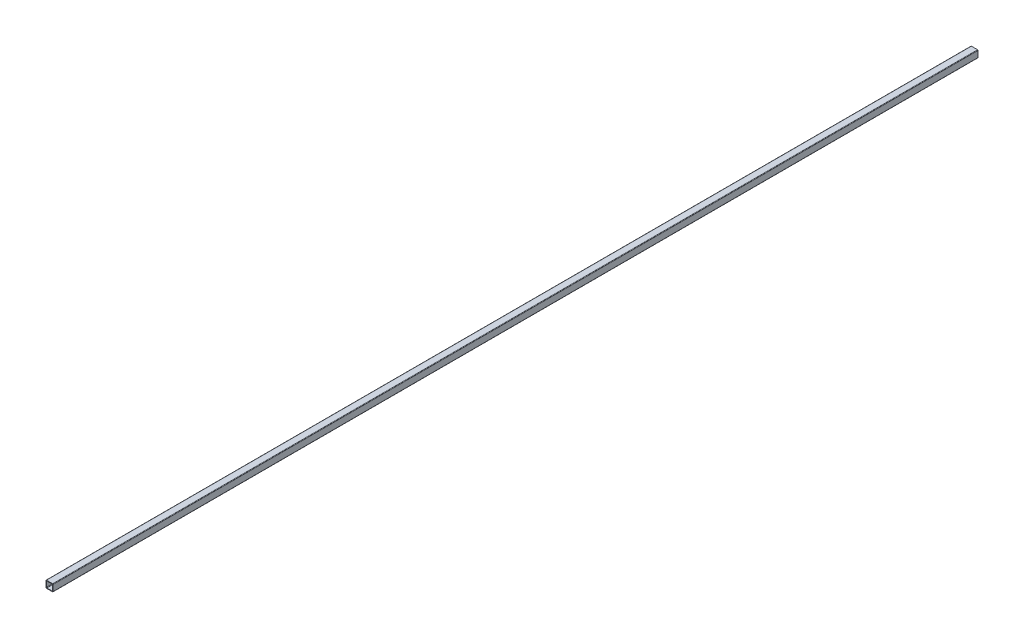
ISO-10303-21;
HEADER;
FILE_DESCRIPTION(('STEP AP214'),'2;1');
FILE_NAME('part.step','',(''),(''),'','','');
FILE_SCHEMA(('AUTOMOTIVE_DESIGN { 1 0 10303 214 1 1 1 1 }'));
ENDSEC;
DATA;
#1=APPLICATION_CONTEXT('core data for automotive mechanical design processes');
#2=APPLICATION_PROTOCOL_DEFINITION('international standard','automotive_design',2000,#1);
#3=PRODUCT_CONTEXT('',#1,'mechanical');
#4=PRODUCT('Part','Part','',(#3));
#5=PRODUCT_RELATED_PRODUCT_CATEGORY('part','',(#4));
#6=PRODUCT_DEFINITION_FORMATION('','',#4);
#7=PRODUCT_DEFINITION_CONTEXT('part definition',#1,'design');
#8=PRODUCT_DEFINITION('design','',#6,#7);
#9=PRODUCT_DEFINITION_SHAPE('','',#8);
#10=(LENGTH_UNIT() NAMED_UNIT(*) SI_UNIT(.MILLI.,.METRE.));
#11=(NAMED_UNIT(*) PLANE_ANGLE_UNIT() SI_UNIT($,.RADIAN.));
#12=(NAMED_UNIT(*) SI_UNIT($,.STERADIAN.) SOLID_ANGLE_UNIT());
#13=UNCERTAINTY_MEASURE_WITH_UNIT(LENGTH_MEASURE(1.E-05),#10,'distance_accuracy_value','');
#14=(GEOMETRIC_REPRESENTATION_CONTEXT(3) GLOBAL_UNCERTAINTY_ASSIGNED_CONTEXT((#13)) GLOBAL_UNIT_ASSIGNED_CONTEXT((#10,
#11,#12)) REPRESENTATION_CONTEXT('',''));
#15=CARTESIAN_POINT('',(0.,0.,0.));
#16=DIRECTION('',(0.,0.,1.));
#17=DIRECTION('',(1.,0.,0.));
#18=AXIS2_PLACEMENT_3D('',#15,#16,#17);
#19=CARTESIAN_POINT('',(2.54,-35.56,5000.));
#20=DIRECTION('',(0.,0.,1.));
#21=DIRECTION('',(1.,0.,0.));
#22=AXIS2_PLACEMENT_3D('',#19,#20,#21);
#23=PLANE('',#22);
#24=CARTESIAN_POINT('',(2.54,-35.56,5000.));
#25=DIRECTION('',(0.,0.,1.));
#26=DIRECTION('',(1.,0.,0.));
#27=AXIS2_PLACEMENT_3D('',#24,#25,#26);
#28=CIRCLE('',#27,2.54);
#29=CARTESIAN_POINT('',(0.,-35.56,5000.));
#30=VERTEX_POINT('',#29);
#31=CARTESIAN_POINT('',(2.54000000000002,-38.1,5000.));
#32=VERTEX_POINT('',#31);
#33=EDGE_CURVE('E214',#30,#32,#28,.T.);
#34=ORIENTED_EDGE('',*,*,#33,.T.);
#35=DIRECTION('',(1.,0.,0.));
#36=VECTOR('',#35,1.);
#37=CARTESIAN_POINT('',(2.54000000000002,-38.1,5000.));
#38=LINE('',#37,#36);
#39=CARTESIAN_POINT('',(35.56,-38.1,5000.));
#40=VERTEX_POINT('',#39);
#41=EDGE_CURVE('E217',#32,#40,#38,.T.);
#42=ORIENTED_EDGE('',*,*,#41,.T.);
#43=CARTESIAN_POINT('',(35.56,-35.56,5000.));
#44=DIRECTION('',(0.,0.,1.));
#45=DIRECTION('',(-1.,0.,0.));
#46=AXIS2_PLACEMENT_3D('',#43,#44,#45);
#47=CIRCLE('',#46,2.54);
#48=CARTESIAN_POINT('',(38.1,-35.56,5000.));
#49=VERTEX_POINT('',#48);
#50=EDGE_CURVE('E220',#40,#49,#47,.T.);
#51=ORIENTED_EDGE('',*,*,#50,.T.);
#52=DIRECTION('',(0.,1.,0.));
#53=VECTOR('',#52,1.);
#54=CARTESIAN_POINT('',(38.1,-2.54000000000002,5000.));
#55=LINE('',#54,#53);
#56=CARTESIAN_POINT('',(38.1,-2.54000000000002,5000.));
#57=VERTEX_POINT('',#56);
#58=EDGE_CURVE('E222',#49,#57,#55,.T.);
#59=ORIENTED_EDGE('',*,*,#58,.T.);
#60=CARTESIAN_POINT('',(35.56,-2.54,5000.));
#61=DIRECTION('',(0.,0.,1.));
#62=DIRECTION('',(1.,0.,0.));
#63=AXIS2_PLACEMENT_3D('',#60,#61,#62);
#64=CIRCLE('',#63,2.54);
#65=CARTESIAN_POINT('',(35.56,0.,5000.));
#66=VERTEX_POINT('',#65);
#67=EDGE_CURVE('E224',#57,#66,#64,.T.);
#68=ORIENTED_EDGE('',*,*,#67,.T.);
#69=DIRECTION('',(-1.,0.,0.));
#70=VECTOR('',#69,1.);
#71=CARTESIAN_POINT('',(2.54000000000002,0.,5000.));
#72=LINE('',#71,#70);
#73=CARTESIAN_POINT('',(2.54000000000002,0.,5000.));
#74=VERTEX_POINT('',#73);
#75=EDGE_CURVE('E226',#66,#74,#72,.T.);
#76=ORIENTED_EDGE('',*,*,#75,.T.);
#77=CARTESIAN_POINT('',(2.54,-2.54,5000.));
#78=DIRECTION('',(0.,0.,1.));
#79=DIRECTION('',(-1.,0.,0.));
#80=AXIS2_PLACEMENT_3D('',#77,#78,#79);
#81=CIRCLE('',#80,2.54);
#82=CARTESIAN_POINT('',(0.,-2.54000000000002,5000.));
#83=VERTEX_POINT('',#82);
#84=EDGE_CURVE('E228',#74,#83,#81,.T.);
#85=ORIENTED_EDGE('',*,*,#84,.T.);
#86=DIRECTION('',(0.,-1.,0.));
#87=VECTOR('',#86,1.);
#88=CARTESIAN_POINT('',(0.,-2.54000000000002,5000.));
#89=LINE('',#88,#87);
#90=EDGE_CURVE('E230',#83,#30,#89,.T.);
#91=ORIENTED_EDGE('',*,*,#90,.T.);
#92=EDGE_LOOP('',(#34,#42,#51,#59,#68,#76,#85,#91));
#93=FACE_BOUND('',#92,.T.);
#94=DIRECTION('',(1.,0.,0.));
#95=VECTOR('',#94,1.);
#96=CARTESIAN_POINT('',(5.30860000000002,-35.3314,5000.));
#97=LINE('',#96,#95);
#98=CARTESIAN_POINT('',(5.30860000000002,-35.3314,5000.));
#99=VERTEX_POINT('',#98);
#100=CARTESIAN_POINT('',(32.7914,-35.3314,5000.));
#101=VERTEX_POINT('',#100);
#102=EDGE_CURVE('E157',#99,#101,#97,.T.);
#103=ORIENTED_EDGE('',*,*,#102,.F.);
#104=CARTESIAN_POINT('',(5.3086,-32.7914,5000.));
#105=DIRECTION('',(0.,0.,1.));
#106=DIRECTION('',(1.,0.,0.));
#107=AXIS2_PLACEMENT_3D('',#104,#105,#106);
#108=CIRCLE('',#107,2.54);
#109=CARTESIAN_POINT('',(2.7686,-32.7914,5000.));
#110=VERTEX_POINT('',#109);
#111=EDGE_CURVE('E149',#110,#99,#108,.T.);
#112=ORIENTED_EDGE('',*,*,#111,.F.);
#113=DIRECTION('',(0.,-1.,0.));
#114=VECTOR('',#113,1.);
#115=CARTESIAN_POINT('',(2.7686,-5.30860000000002,5000.));
#116=LINE('',#115,#114);
#117=CARTESIAN_POINT('',(2.7686,-5.30860000000002,5000.));
#118=VERTEX_POINT('',#117);
#119=EDGE_CURVE('E182',#118,#110,#116,.T.);
#120=ORIENTED_EDGE('',*,*,#119,.F.);
#121=CARTESIAN_POINT('',(5.3086,-5.3086,5000.));
#122=DIRECTION('',(0.,0.,1.));
#123=DIRECTION('',(1.,0.,0.));
#124=AXIS2_PLACEMENT_3D('',#121,#122,#123);
#125=CIRCLE('',#124,2.54);
#126=CARTESIAN_POINT('',(5.30860000000002,-2.7686,5000.));
#127=VERTEX_POINT('',#126);
#128=EDGE_CURVE('E180',#127,#118,#125,.T.);
#129=ORIENTED_EDGE('',*,*,#128,.F.);
#130=DIRECTION('',(-1.,0.,0.));
#131=VECTOR('',#130,1.);
#132=CARTESIAN_POINT('',(5.30860000000002,-2.7686,5000.));
#133=LINE('',#132,#131);
#134=CARTESIAN_POINT('',(32.7914,-2.7686,5000.));
#135=VERTEX_POINT('',#134);
#136=EDGE_CURVE('E178',#135,#127,#133,.T.);
#137=ORIENTED_EDGE('',*,*,#136,.F.);
#138=CARTESIAN_POINT('',(32.7914,-5.3086,5000.));
#139=DIRECTION('',(0.,0.,1.));
#140=DIRECTION('',(1.,0.,0.));
#141=AXIS2_PLACEMENT_3D('',#138,#139,#140);
#142=CIRCLE('',#141,2.54);
#143=CARTESIAN_POINT('',(35.3314,-5.30860000000002,5000.));
#144=VERTEX_POINT('',#143);
#145=EDGE_CURVE('E176',#144,#135,#142,.T.);
#146=ORIENTED_EDGE('',*,*,#145,.F.);
#147=DIRECTION('',(0.,1.,0.));
#148=VECTOR('',#147,1.);
#149=CARTESIAN_POINT('',(35.3314,-5.30860000000002,5000.));
#150=LINE('',#149,#148);
#151=CARTESIAN_POINT('',(35.3314,-32.7914,5000.));
#152=VERTEX_POINT('',#151);
#153=EDGE_CURVE('E172',#152,#144,#150,.T.);
#154=ORIENTED_EDGE('',*,*,#153,.F.);
#155=CARTESIAN_POINT('',(32.7914,-32.7914,5000.));
#156=DIRECTION('',(0.,0.,1.));
#157=DIRECTION('',(1.,0.,0.));
#158=AXIS2_PLACEMENT_3D('',#155,#156,#157);
#159=CIRCLE('',#158,2.54);
#160=EDGE_CURVE('E170',#101,#152,#159,.T.);
#161=ORIENTED_EDGE('',*,*,#160,.F.);
#162=EDGE_LOOP('',(#103,#112,#120,#129,#137,#146,#154,#161));
#163=FACE_BOUND('',#162,.T.);
#164=ADVANCED_FACE('F36',(#93,#163),#23,.T.);
#165=CARTESIAN_POINT('',(2.54,-35.56,0.));
#166=DIRECTION('',(0.,0.,1.));
#167=DIRECTION('',(1.,0.,0.));
#168=AXIS2_PLACEMENT_3D('',#165,#166,#167);
#169=PLANE('',#168);
#170=CARTESIAN_POINT('',(2.54,-35.56,0.));
#171=DIRECTION('',(0.,0.,1.));
#172=DIRECTION('',(1.,0.,0.));
#173=AXIS2_PLACEMENT_3D('',#170,#171,#172);
#174=CIRCLE('',#173,2.54);
#175=CARTESIAN_POINT('',(0.,-35.56,0.));
#176=VERTEX_POINT('',#175);
#177=CARTESIAN_POINT('',(2.54000000000002,-38.1,0.));
#178=VERTEX_POINT('',#177);
#179=EDGE_CURVE('E165',#176,#178,#174,.T.);
#180=ORIENTED_EDGE('',*,*,#179,.F.);
#181=DIRECTION('',(0.,-1.,0.));
#182=VECTOR('',#181,1.);
#183=CARTESIAN_POINT('',(0.,-2.54000000000002,0.));
#184=LINE('',#183,#182);
#185=CARTESIAN_POINT('',(0.,-2.54000000000002,0.));
#186=VERTEX_POINT('',#185);
#187=EDGE_CURVE('E218',#186,#176,#184,.T.);
#188=ORIENTED_EDGE('',*,*,#187,.F.);
#189=CARTESIAN_POINT('',(2.54,-2.54,0.));
#190=DIRECTION('',(0.,0.,1.));
#191=DIRECTION('',(-1.,0.,0.));
#192=AXIS2_PLACEMENT_3D('',#189,#190,#191);
#193=CIRCLE('',#192,2.54);
#194=CARTESIAN_POINT('',(2.54000000000002,0.,0.));
#195=VERTEX_POINT('',#194);
#196=EDGE_CURVE('E245',#195,#186,#193,.T.);
#197=ORIENTED_EDGE('',*,*,#196,.F.);
#198=DIRECTION('',(-1.,0.,0.));
#199=VECTOR('',#198,1.);
#200=CARTESIAN_POINT('',(2.54000000000002,0.,0.));
#201=LINE('',#200,#199);
#202=CARTESIAN_POINT('',(35.56,0.,0.));
#203=VERTEX_POINT('',#202);
#204=EDGE_CURVE('E243',#203,#195,#201,.T.);
#205=ORIENTED_EDGE('',*,*,#204,.F.);
#206=CARTESIAN_POINT('',(35.56,-2.54,0.));
#207=DIRECTION('',(0.,0.,1.));
#208=DIRECTION('',(1.,0.,0.));
#209=AXIS2_PLACEMENT_3D('',#206,#207,#208);
#210=CIRCLE('',#209,2.54);
#211=CARTESIAN_POINT('',(38.1,-2.54000000000002,0.));
#212=VERTEX_POINT('',#211);
#213=EDGE_CURVE('E241',#212,#203,#210,.T.);
#214=ORIENTED_EDGE('',*,*,#213,.F.);
#215=DIRECTION('',(0.,1.,0.));
#216=VECTOR('',#215,1.);
#217=CARTESIAN_POINT('',(38.1,-2.54000000000002,0.));
#218=LINE('',#217,#216);
#219=CARTESIAN_POINT('',(38.1,-35.56,0.));
#220=VERTEX_POINT('',#219);
#221=EDGE_CURVE('E239',#220,#212,#218,.T.);
#222=ORIENTED_EDGE('',*,*,#221,.F.);
#223=CARTESIAN_POINT('',(35.56,-35.56,0.));
#224=DIRECTION('',(0.,0.,1.));
#225=DIRECTION('',(-1.,0.,0.));
#226=AXIS2_PLACEMENT_3D('',#223,#224,#225);
#227=CIRCLE('',#226,2.54);
#228=CARTESIAN_POINT('',(35.56,-38.1,0.));
#229=VERTEX_POINT('',#228);
#230=EDGE_CURVE('E237',#229,#220,#227,.T.);
#231=ORIENTED_EDGE('',*,*,#230,.F.);
#232=DIRECTION('',(1.,0.,0.));
#233=VECTOR('',#232,1.);
#234=CARTESIAN_POINT('',(2.54000000000002,-38.1,0.));
#235=LINE('',#234,#233);
#236=EDGE_CURVE('E235',#178,#229,#235,.T.);
#237=ORIENTED_EDGE('',*,*,#236,.F.);
#238=EDGE_LOOP('',(#180,#188,#197,#205,#214,#222,#231,#237));
#239=FACE_BOUND('',#238,.T.);
#240=CARTESIAN_POINT('',(5.3086,-32.7914,0.));
#241=DIRECTION('',(0.,0.,1.));
#242=DIRECTION('',(1.,0.,0.));
#243=AXIS2_PLACEMENT_3D('',#240,#241,#242);
#244=CIRCLE('',#243,2.54);
#245=CARTESIAN_POINT('',(2.7686,-32.7914,0.));
#246=VERTEX_POINT('',#245);
#247=CARTESIAN_POINT('',(5.30860000000002,-35.3314,0.));
#248=VERTEX_POINT('',#247);
#249=EDGE_CURVE('E59',#246,#248,#244,.T.);
#250=ORIENTED_EDGE('',*,*,#249,.T.);
#251=DIRECTION('',(1.,0.,0.));
#252=VECTOR('',#251,1.);
#253=CARTESIAN_POINT('',(5.30860000000002,-35.3314,0.));
#254=LINE('',#253,#252);
#255=CARTESIAN_POINT('',(32.7914,-35.3314,0.));
#256=VERTEX_POINT('',#255);
#257=EDGE_CURVE('E164',#248,#256,#254,.T.);
#258=ORIENTED_EDGE('',*,*,#257,.T.);
#259=CARTESIAN_POINT('',(32.7914,-32.7914,0.));
#260=DIRECTION('',(0.,0.,1.));
#261=DIRECTION('',(1.,0.,0.));
#262=AXIS2_PLACEMENT_3D('',#259,#260,#261);
#263=CIRCLE('',#262,2.54);
#264=CARTESIAN_POINT('',(35.3314,-32.7914,0.));
#265=VERTEX_POINT('',#264);
#266=EDGE_CURVE('E186',#256,#265,#263,.T.);
#267=ORIENTED_EDGE('',*,*,#266,.T.);
#268=DIRECTION('',(0.,1.,0.));
#269=VECTOR('',#268,1.);
#270=CARTESIAN_POINT('',(35.3314,-5.30860000000002,0.));
#271=LINE('',#270,#269);
#272=CARTESIAN_POINT('',(35.3314,-5.30860000000002,0.));
#273=VERTEX_POINT('',#272);
#274=EDGE_CURVE('E189',#265,#273,#271,.T.);
#275=ORIENTED_EDGE('',*,*,#274,.T.);
#276=CARTESIAN_POINT('',(32.7914,-5.3086,0.));
#277=DIRECTION('',(0.,0.,1.));
#278=DIRECTION('',(1.,0.,0.));
#279=AXIS2_PLACEMENT_3D('',#276,#277,#278);
#280=CIRCLE('',#279,2.54);
#281=CARTESIAN_POINT('',(32.7914,-2.7686,0.));
#282=VERTEX_POINT('',#281);
#283=EDGE_CURVE('E192',#273,#282,#280,.T.);
#284=ORIENTED_EDGE('',*,*,#283,.T.);
#285=DIRECTION('',(-1.,0.,0.));
#286=VECTOR('',#285,1.);
#287=CARTESIAN_POINT('',(5.30860000000002,-2.7686,0.));
#288=LINE('',#287,#286);
#289=CARTESIAN_POINT('',(5.30860000000002,-2.7686,0.));
#290=VERTEX_POINT('',#289);
#291=EDGE_CURVE('E195',#282,#290,#288,.T.);
#292=ORIENTED_EDGE('',*,*,#291,.T.);
#293=CARTESIAN_POINT('',(5.3086,-5.3086,0.));
#294=DIRECTION('',(0.,0.,1.));
#295=DIRECTION('',(1.,0.,0.));
#296=AXIS2_PLACEMENT_3D('',#293,#294,#295);
#297=CIRCLE('',#296,2.54);
#298=CARTESIAN_POINT('',(2.7686,-5.30860000000002,0.));
#299=VERTEX_POINT('',#298);
#300=EDGE_CURVE('E198',#290,#299,#297,.T.);
#301=ORIENTED_EDGE('',*,*,#300,.T.);
#302=DIRECTION('',(0.,-1.,0.));
#303=VECTOR('',#302,1.);
#304=CARTESIAN_POINT('',(2.7686,-5.30860000000002,0.));
#305=LINE('',#304,#303);
#306=EDGE_CURVE('E158',#299,#246,#305,.T.);
#307=ORIENTED_EDGE('',*,*,#306,.T.);
#308=EDGE_LOOP('',(#250,#258,#267,#275,#284,#292,#301,#307));
#309=FACE_BOUND('',#308,.T.);
#310=ADVANCED_FACE('F275',(#239,#309),#169,.F.);
#311=CARTESIAN_POINT('',(2.54,-35.56,5000.));
#312=DIRECTION('',(0.,0.,-1.));
#313=DIRECTION('',(-1.,0.,0.));
#314=AXIS2_PLACEMENT_3D('',#311,#312,#313);
#315=CYLINDRICAL_SURFACE('',#314,2.54);
#316=ORIENTED_EDGE('',*,*,#179,.T.);
#317=DIRECTION('',(0.,0.,-1.));
#318=VECTOR('',#317,1.);
#319=CARTESIAN_POINT('',(2.54000000000002,-38.1,5000.));
#320=LINE('',#319,#318);
#321=EDGE_CURVE('E11',#32,#178,#320,.T.);
#322=ORIENTED_EDGE('',*,*,#321,.F.);
#323=ORIENTED_EDGE('',*,*,#33,.F.);
#324=DIRECTION('',(0.,0.,-1.));
#325=VECTOR('',#324,1.);
#326=CARTESIAN_POINT('',(0.,-35.56,5000.));
#327=LINE('',#326,#325);
#328=EDGE_CURVE('E232',#30,#176,#327,.T.);
#329=ORIENTED_EDGE('',*,*,#328,.T.);
#330=EDGE_LOOP('',(#316,#322,#323,#329));
#331=FACE_BOUND('',#330,.T.);
#332=ADVANCED_FACE('F38',(#331),#315,.T.);
#333=CARTESIAN_POINT('',(2.54000000000002,-38.1,5000.));
#334=DIRECTION('',(0.,1.,0.));
#335=DIRECTION('',(0.,0.,1.));
#336=AXIS2_PLACEMENT_3D('',#333,#334,#335);
#337=PLANE('',#336);
#338=ORIENTED_EDGE('',*,*,#236,.T.);
#339=DIRECTION('',(0.,0.,-1.));
#340=VECTOR('',#339,1.);
#341=CARTESIAN_POINT('',(35.56,-38.1,5000.));
#342=LINE('',#341,#340);
#343=EDGE_CURVE('E44',#40,#229,#342,.T.);
#344=ORIENTED_EDGE('',*,*,#343,.F.);
#345=ORIENTED_EDGE('',*,*,#41,.F.);
#346=ORIENTED_EDGE('',*,*,#321,.T.);
#347=EDGE_LOOP('',(#338,#344,#345,#346));
#348=FACE_BOUND('',#347,.T.);
#349=ADVANCED_FACE('F292',(#348),#337,.F.);
#350=CARTESIAN_POINT('',(35.56,-35.56,5000.));
#351=DIRECTION('',(0.,0.,-1.));
#352=DIRECTION('',(-1.,0.,0.));
#353=AXIS2_PLACEMENT_3D('',#350,#351,#352);
#354=CYLINDRICAL_SURFACE('',#353,2.54);
#355=ORIENTED_EDGE('',*,*,#230,.T.);
#356=DIRECTION('',(0.,0.,-1.));
#357=VECTOR('',#356,1.);
#358=CARTESIAN_POINT('',(38.1,-35.56,5000.));
#359=LINE('',#358,#357);
#360=EDGE_CURVE('E262',#49,#220,#359,.T.);
#361=ORIENTED_EDGE('',*,*,#360,.F.);
#362=ORIENTED_EDGE('',*,*,#50,.F.);
#363=ORIENTED_EDGE('',*,*,#343,.T.);
#364=EDGE_LOOP('',(#355,#361,#362,#363));
#365=FACE_BOUND('',#364,.T.);
#366=ADVANCED_FACE('F269',(#365),#354,.T.);
#367=CARTESIAN_POINT('',(38.1,-2.54000000000002,5000.));
#368=DIRECTION('',(-1.,0.,0.));
#369=DIRECTION('',(0.,-1.,0.));
#370=AXIS2_PLACEMENT_3D('',#367,#368,#369);
#371=PLANE('',#370);
#372=ORIENTED_EDGE('',*,*,#221,.T.);
#373=DIRECTION('',(0.,0.,-1.));
#374=VECTOR('',#373,1.);
#375=CARTESIAN_POINT('',(38.1,-2.54000000000002,5000.));
#376=LINE('',#375,#374);
#377=EDGE_CURVE('E259',#57,#212,#376,.T.);
#378=ORIENTED_EDGE('',*,*,#377,.F.);
#379=ORIENTED_EDGE('',*,*,#58,.F.);
#380=ORIENTED_EDGE('',*,*,#360,.T.);
#381=EDGE_LOOP('',(#372,#378,#379,#380));
#382=FACE_BOUND('',#381,.T.);
#383=ADVANCED_FACE('F281',(#382),#371,.F.);
#384=CARTESIAN_POINT('',(35.56,-2.54,5000.));
#385=DIRECTION('',(0.,0.,-1.));
#386=DIRECTION('',(-1.,0.,0.));
#387=AXIS2_PLACEMENT_3D('',#384,#385,#386);
#388=CYLINDRICAL_SURFACE('',#387,2.54);
#389=ORIENTED_EDGE('',*,*,#213,.T.);
#390=DIRECTION('',(0.,0.,-1.));
#391=VECTOR('',#390,1.);
#392=CARTESIAN_POINT('',(35.56,0.,5000.));
#393=LINE('',#392,#391);
#394=EDGE_CURVE('E256',#66,#203,#393,.T.);
#395=ORIENTED_EDGE('',*,*,#394,.F.);
#396=ORIENTED_EDGE('',*,*,#67,.F.);
#397=ORIENTED_EDGE('',*,*,#377,.T.);
#398=EDGE_LOOP('',(#389,#395,#396,#397));
#399=FACE_BOUND('',#398,.T.);
#400=ADVANCED_FACE('F285',(#399),#388,.T.);
#401=CARTESIAN_POINT('',(2.54000000000002,0.,5000.));
#402=DIRECTION('',(0.,-1.,0.));
#403=DIRECTION('',(0.,0.,-1.));
#404=AXIS2_PLACEMENT_3D('',#401,#402,#403);
#405=PLANE('',#404);
#406=ORIENTED_EDGE('',*,*,#204,.T.);
#407=DIRECTION('',(0.,0.,-1.));
#408=VECTOR('',#407,1.);
#409=CARTESIAN_POINT('',(2.54000000000002,0.,5000.));
#410=LINE('',#409,#408);
#411=EDGE_CURVE('E253',#74,#195,#410,.T.);
#412=ORIENTED_EDGE('',*,*,#411,.F.);
#413=ORIENTED_EDGE('',*,*,#75,.F.);
#414=ORIENTED_EDGE('',*,*,#394,.T.);
#415=EDGE_LOOP('',(#406,#412,#413,#414));
#416=FACE_BOUND('',#415,.T.);
#417=ADVANCED_FACE('F305',(#416),#405,.F.);
#418=CARTESIAN_POINT('',(2.54,-2.54,5000.));
#419=DIRECTION('',(0.,0.,-1.));
#420=DIRECTION('',(-1.,0.,0.));
#421=AXIS2_PLACEMENT_3D('',#418,#419,#420);
#422=CYLINDRICAL_SURFACE('',#421,2.54);
#423=ORIENTED_EDGE('',*,*,#196,.T.);
#424=DIRECTION('',(0.,0.,-1.));
#425=VECTOR('',#424,1.);
#426=CARTESIAN_POINT('',(0.,-2.54000000000002,5000.));
#427=LINE('',#426,#425);
#428=EDGE_CURVE('E250',#83,#186,#427,.T.);
#429=ORIENTED_EDGE('',*,*,#428,.F.);
#430=ORIENTED_EDGE('',*,*,#84,.F.);
#431=ORIENTED_EDGE('',*,*,#411,.T.);
#432=EDGE_LOOP('',(#423,#429,#430,#431));
#433=FACE_BOUND('',#432,.T.);
#434=ADVANCED_FACE('F303',(#433),#422,.T.);
#435=CARTESIAN_POINT('',(0.,-2.54000000000002,5000.));
#436=DIRECTION('',(1.,0.,0.));
#437=DIRECTION('',(0.,1.,0.));
#438=AXIS2_PLACEMENT_3D('',#435,#436,#437);
#439=PLANE('',#438);
#440=ORIENTED_EDGE('',*,*,#187,.T.);
#441=ORIENTED_EDGE('',*,*,#328,.F.);
#442=ORIENTED_EDGE('',*,*,#90,.F.);
#443=ORIENTED_EDGE('',*,*,#428,.T.);
#444=EDGE_LOOP('',(#440,#441,#442,#443));
#445=FACE_BOUND('',#444,.T.);
#446=ADVANCED_FACE('F298',(#445),#439,.F.);
#447=CARTESIAN_POINT('',(5.3086,-32.7914,5000.));
#448=DIRECTION('',(0.,0.,-1.));
#449=DIRECTION('',(-1.,0.,0.));
#450=AXIS2_PLACEMENT_3D('',#447,#448,#449);
#451=CYLINDRICAL_SURFACE('',#450,2.54);
#452=ORIENTED_EDGE('',*,*,#249,.F.);
#453=DIRECTION('',(0.,0.,-1.));
#454=VECTOR('',#453,1.);
#455=CARTESIAN_POINT('',(2.7686,-32.7914,5000.));
#456=LINE('',#455,#454);
#457=EDGE_CURVE('E153',#110,#246,#456,.T.);
#458=ORIENTED_EDGE('',*,*,#457,.F.);
#459=ORIENTED_EDGE('',*,*,#111,.T.);
#460=DIRECTION('',(0.,0.,-1.));
#461=VECTOR('',#460,1.);
#462=CARTESIAN_POINT('',(5.30860000000002,-35.3314,5000.));
#463=LINE('',#462,#461);
#464=EDGE_CURVE('E152',#99,#248,#463,.T.);
#465=ORIENTED_EDGE('',*,*,#464,.T.);
#466=EDGE_LOOP('',(#452,#458,#459,#465));
#467=FACE_BOUND('',#466,.T.);
#468=ADVANCED_FACE('F151',(#467),#451,.F.);
#469=CARTESIAN_POINT('',(5.30860000000002,-35.3314,5000.));
#470=DIRECTION('',(0.,1.,0.));
#471=DIRECTION('',(0.,0.,1.));
#472=AXIS2_PLACEMENT_3D('',#469,#470,#471);
#473=PLANE('',#472);
#474=ORIENTED_EDGE('',*,*,#257,.F.);
#475=ORIENTED_EDGE('',*,*,#464,.F.);
#476=ORIENTED_EDGE('',*,*,#102,.T.);
#477=DIRECTION('',(0.,0.,-1.));
#478=VECTOR('',#477,1.);
#479=CARTESIAN_POINT('',(32.7914,-35.3314,5000.));
#480=LINE('',#479,#478);
#481=EDGE_CURVE('E166',#101,#256,#480,.T.);
#482=ORIENTED_EDGE('',*,*,#481,.T.);
#483=EDGE_LOOP('',(#474,#475,#476,#482));
#484=FACE_BOUND('',#483,.T.);
#485=ADVANCED_FACE('F161',(#484),#473,.T.);
#486=CARTESIAN_POINT('',(32.7914,-32.7914,5000.));
#487=DIRECTION('',(0.,0.,-1.));
#488=DIRECTION('',(-1.,0.,0.));
#489=AXIS2_PLACEMENT_3D('',#486,#487,#488);
#490=CYLINDRICAL_SURFACE('',#489,2.54);
#491=ORIENTED_EDGE('',*,*,#266,.F.);
#492=ORIENTED_EDGE('',*,*,#481,.F.);
#493=ORIENTED_EDGE('',*,*,#160,.T.);
#494=DIRECTION('',(0.,0.,-1.));
#495=VECTOR('',#494,1.);
#496=CARTESIAN_POINT('',(35.3314,-32.7914,5000.));
#497=LINE('',#496,#495);
#498=EDGE_CURVE('E211',#152,#265,#497,.T.);
#499=ORIENTED_EDGE('',*,*,#498,.T.);
#500=EDGE_LOOP('',(#491,#492,#493,#499));
#501=FACE_BOUND('',#500,.T.);
#502=ADVANCED_FACE('F330',(#501),#490,.F.);
#503=CARTESIAN_POINT('',(35.3314,-5.30860000000002,5000.));
#504=DIRECTION('',(-1.,0.,0.));
#505=DIRECTION('',(0.,0.,1.));
#506=AXIS2_PLACEMENT_3D('',#503,#504,#505);
#507=PLANE('',#506);
#508=ORIENTED_EDGE('',*,*,#274,.F.);
#509=ORIENTED_EDGE('',*,*,#498,.F.);
#510=ORIENTED_EDGE('',*,*,#153,.T.);
#511=DIRECTION('',(0.,0.,-1.));
#512=VECTOR('',#511,1.);
#513=CARTESIAN_POINT('',(35.3314,-5.30860000000002,5000.));
#514=LINE('',#513,#512);
#515=EDGE_CURVE('E209',#144,#273,#514,.T.);
#516=ORIENTED_EDGE('',*,*,#515,.T.);
#517=EDGE_LOOP('',(#508,#509,#510,#516));
#518=FACE_BOUND('',#517,.T.);
#519=ADVANCED_FACE('F334',(#518),#507,.T.);
#520=CARTESIAN_POINT('',(32.7914,-5.3086,5000.));
#521=DIRECTION('',(0.,0.,-1.));
#522=DIRECTION('',(-1.,0.,0.));
#523=AXIS2_PLACEMENT_3D('',#520,#521,#522);
#524=CYLINDRICAL_SURFACE('',#523,2.54);
#525=ORIENTED_EDGE('',*,*,#283,.F.);
#526=ORIENTED_EDGE('',*,*,#515,.F.);
#527=ORIENTED_EDGE('',*,*,#145,.T.);
#528=DIRECTION('',(0.,0.,-1.));
#529=VECTOR('',#528,1.);
#530=CARTESIAN_POINT('',(32.7914,-2.7686,5000.));
#531=LINE('',#530,#529);
#532=EDGE_CURVE('E207',#135,#282,#531,.T.);
#533=ORIENTED_EDGE('',*,*,#532,.T.);
#534=EDGE_LOOP('',(#525,#526,#527,#533));
#535=FACE_BOUND('',#534,.T.);
#536=ADVANCED_FACE('F340',(#535),#524,.F.);
#537=CARTESIAN_POINT('',(5.30860000000002,-2.7686,5000.));
#538=DIRECTION('',(0.,-1.,0.));
#539=DIRECTION('',(0.,0.,-1.));
#540=AXIS2_PLACEMENT_3D('',#537,#538,#539);
#541=PLANE('',#540);
#542=ORIENTED_EDGE('',*,*,#291,.F.);
#543=ORIENTED_EDGE('',*,*,#532,.F.);
#544=ORIENTED_EDGE('',*,*,#136,.T.);
#545=DIRECTION('',(0.,0.,-1.));
#546=VECTOR('',#545,1.);
#547=CARTESIAN_POINT('',(5.30860000000002,-2.7686,5000.));
#548=LINE('',#547,#546);
#549=EDGE_CURVE('E205',#127,#290,#548,.T.);
#550=ORIENTED_EDGE('',*,*,#549,.T.);
#551=EDGE_LOOP('',(#542,#543,#544,#550));
#552=FACE_BOUND('',#551,.T.);
#553=ADVANCED_FACE('F344',(#552),#541,.T.);
#554=CARTESIAN_POINT('',(5.3086,-5.3086,5000.));
#555=DIRECTION('',(0.,0.,-1.));
#556=DIRECTION('',(-1.,0.,0.));
#557=AXIS2_PLACEMENT_3D('',#554,#555,#556);
#558=CYLINDRICAL_SURFACE('',#557,2.54);
#559=ORIENTED_EDGE('',*,*,#300,.F.);
#560=ORIENTED_EDGE('',*,*,#549,.F.);
#561=ORIENTED_EDGE('',*,*,#128,.T.);
#562=DIRECTION('',(0.,0.,-1.));
#563=VECTOR('',#562,1.);
#564=CARTESIAN_POINT('',(2.7686,-5.30860000000002,5000.));
#565=LINE('',#564,#563);
#566=EDGE_CURVE('E51',#118,#299,#565,.T.);
#567=ORIENTED_EDGE('',*,*,#566,.T.);
#568=EDGE_LOOP('',(#559,#560,#561,#567));
#569=FACE_BOUND('',#568,.T.);
#570=ADVANCED_FACE('F348',(#569),#558,.F.);
#571=CARTESIAN_POINT('',(2.7686,-5.30860000000002,5000.));
#572=DIRECTION('',(1.,0.,0.));
#573=DIRECTION('',(0.,0.,-1.));
#574=AXIS2_PLACEMENT_3D('',#571,#572,#573);
#575=PLANE('',#574);
#576=ORIENTED_EDGE('',*,*,#306,.F.);
#577=ORIENTED_EDGE('',*,*,#566,.F.);
#578=ORIENTED_EDGE('',*,*,#119,.T.);
#579=ORIENTED_EDGE('',*,*,#457,.T.);
#580=EDGE_LOOP('',(#576,#577,#578,#579));
#581=FACE_BOUND('',#580,.T.);
#582=ADVANCED_FACE('F352',(#581),#575,.T.);
#583=CLOSED_SHELL('',(#164,#310,#332,#349,#366,#383,#400,#417,#434,#446,#468,#485,#502,#519,
#536,#553,#570,#582));
#584=MANIFOLD_SOLID_BREP('B2',#583);
#585=ADVANCED_BREP_SHAPE_REPRESENTATION('',(#18,#584),#14);
#586=SHAPE_DEFINITION_REPRESENTATION(#9,#585);
ENDSEC;
END-ISO-10303-21;
